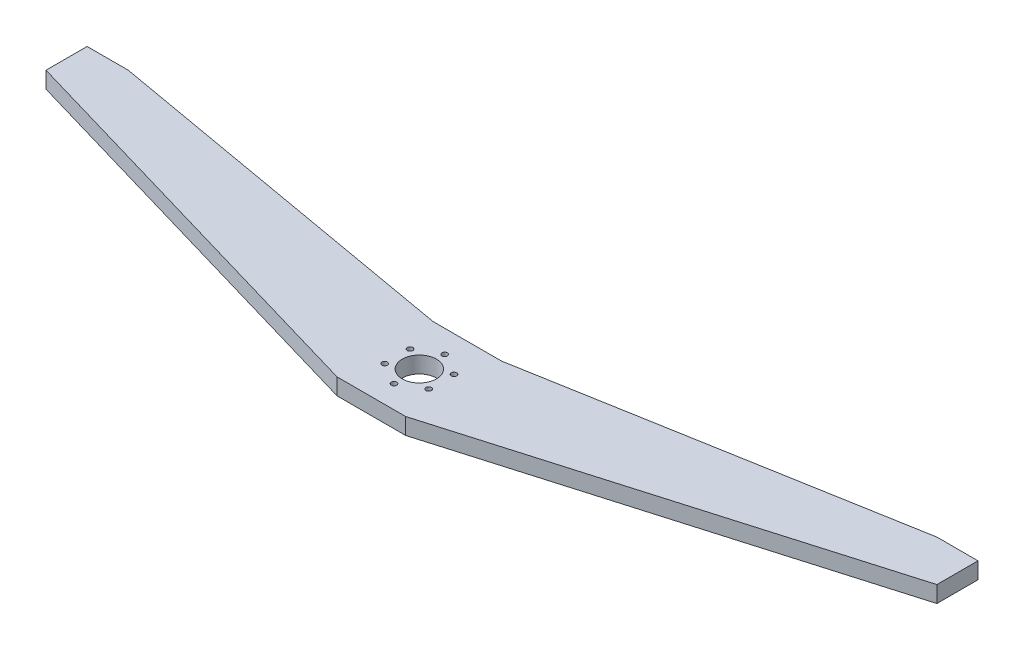
ISO-10303-21;
HEADER;
FILE_DESCRIPTION(('STEP AP214'),'2;1');
FILE_NAME('part.step','',(''),(''),'','','');
FILE_SCHEMA(('AUTOMOTIVE_DESIGN { 1 0 10303 214 1 1 1 1 }'));
ENDSEC;
DATA;
#1=APPLICATION_CONTEXT('core data for automotive mechanical design processes');
#2=APPLICATION_PROTOCOL_DEFINITION('international standard','automotive_design',2000,#1);
#3=PRODUCT_CONTEXT('',#1,'mechanical');
#4=PRODUCT('Part','Part','',(#3));
#5=PRODUCT_RELATED_PRODUCT_CATEGORY('part','',(#4));
#6=PRODUCT_DEFINITION_FORMATION('','',#4);
#7=PRODUCT_DEFINITION_CONTEXT('part definition',#1,'design');
#8=PRODUCT_DEFINITION('design','',#6,#7);
#9=PRODUCT_DEFINITION_SHAPE('','',#8);
#10=(LENGTH_UNIT() NAMED_UNIT(*) SI_UNIT(.MILLI.,.METRE.));
#11=(NAMED_UNIT(*) PLANE_ANGLE_UNIT() SI_UNIT($,.RADIAN.));
#12=(NAMED_UNIT(*) SI_UNIT($,.STERADIAN.) SOLID_ANGLE_UNIT());
#13=UNCERTAINTY_MEASURE_WITH_UNIT(LENGTH_MEASURE(1.E-05),#10,'distance_accuracy_value','');
#14=(GEOMETRIC_REPRESENTATION_CONTEXT(3) GLOBAL_UNCERTAINTY_ASSIGNED_CONTEXT((#13)) GLOBAL_UNIT_ASSIGNED_CONTEXT((#10,
#11,#12)) REPRESENTATION_CONTEXT('',''));
#15=CARTESIAN_POINT('',(0.,0.,0.));
#16=DIRECTION('',(0.,0.,1.));
#17=DIRECTION('',(1.,0.,0.));
#18=AXIS2_PLACEMENT_3D('',#15,#16,#17);
#19=CARTESIAN_POINT('',(-318.206861599198,12.,-87.6082847912839));
#20=DIRECTION('',(1.,0.,0.));
#21=DIRECTION('',(0.,0.,-1.));
#22=AXIS2_PLACEMENT_3D('',#19,#20,#21);
#23=PLANE('',#22);
#24=DIRECTION('',(0.,0.,1.));
#25=VECTOR('',#24,1.);
#26=CARTESIAN_POINT('',(-318.206861599198,0.,-87.6082847912839));
#27=LINE('',#26,#25);
#28=CARTESIAN_POINT('',(-318.206861599198,0.,-117.608284791284));
#29=VERTEX_POINT('',#28);
#30=CARTESIAN_POINT('',(-318.206861599198,0.,-87.6082847912839));
#31=VERTEX_POINT('',#30);
#32=EDGE_CURVE('E146',#29,#31,#27,.T.);
#33=ORIENTED_EDGE('',*,*,#32,.T.);
#34=DIRECTION('',(0.,-1.,0.));
#35=VECTOR('',#34,1.);
#36=CARTESIAN_POINT('',(-318.206861599198,12.,-87.6082847912839));
#37=LINE('',#36,#35);
#38=CARTESIAN_POINT('',(-318.206861599198,12.,-87.6082847912839));
#39=VERTEX_POINT('',#38);
#40=EDGE_CURVE('E11',#39,#31,#37,.T.);
#41=ORIENTED_EDGE('',*,*,#40,.F.);
#42=DIRECTION('',(0.,0.,1.));
#43=VECTOR('',#42,1.);
#44=CARTESIAN_POINT('',(-318.206861599198,12.,-87.6082847912839));
#45=LINE('',#44,#43);
#46=CARTESIAN_POINT('',(-318.206861599198,12.,-117.608284791284));
#47=VERTEX_POINT('',#46);
#48=EDGE_CURVE('E164',#47,#39,#45,.T.);
#49=ORIENTED_EDGE('',*,*,#48,.F.);
#50=DIRECTION('',(0.,-1.,0.));
#51=VECTOR('',#50,1.);
#52=CARTESIAN_POINT('',(-318.206861599198,12.,-117.608284791284));
#53=LINE('',#52,#51);
#54=EDGE_CURVE('E142',#47,#29,#53,.T.);
#55=ORIENTED_EDGE('',*,*,#54,.T.);
#56=EDGE_LOOP('',(#33,#41,#49,#55));
#57=FACE_BOUND('',#56,.T.);
#58=ADVANCED_FACE('F36',(#57),#23,.F.);
#59=CARTESIAN_POINT('',(-318.206861599198,12.,-87.6082847912839));
#60=DIRECTION('',(0.280319298356245,0.,-0.959906813690299));
#61=DIRECTION('',(-0.959906813690299,0.,-0.280319298356245));
#62=AXIS2_PLACEMENT_3D('',#59,#60,#61);
#63=PLANE('',#62);
#64=DIRECTION('',(0.959906813690299,0.,0.280319298356245));
#65=VECTOR('',#64,1.);
#66=CARTESIAN_POINT('',(-318.206861599198,0.,-87.6082847912839));
#67=LINE('',#66,#65);
#68=CARTESIAN_POINT('',(-18.2068615991978,0.,0.));
#69=VERTEX_POINT('',#68);
#70=EDGE_CURVE('E149',#31,#69,#67,.T.);
#71=ORIENTED_EDGE('',*,*,#70,.T.);
#72=DIRECTION('',(0.,-1.,0.));
#73=VECTOR('',#72,1.);
#74=CARTESIAN_POINT('',(-18.2068615991978,12.,0.));
#75=LINE('',#74,#73);
#76=CARTESIAN_POINT('',(-18.2068615991978,12.,0.));
#77=VERTEX_POINT('',#76);
#78=EDGE_CURVE('E45',#77,#69,#75,.T.);
#79=ORIENTED_EDGE('',*,*,#78,.F.);
#80=DIRECTION('',(0.959906813690299,0.,0.280319298356245));
#81=VECTOR('',#80,1.);
#82=CARTESIAN_POINT('',(-318.206861599198,12.,-87.6082847912839));
#83=LINE('',#82,#81);
#84=EDGE_CURVE('E103',#39,#77,#83,.T.);
#85=ORIENTED_EDGE('',*,*,#84,.F.);
#86=ORIENTED_EDGE('',*,*,#40,.T.);
#87=EDGE_LOOP('',(#71,#79,#85,#86));
#88=FACE_BOUND('',#87,.T.);
#89=ADVANCED_FACE('F239',(#88),#63,.F.);
#90=CARTESIAN_POINT('',(-18.2068615991978,12.,0.));
#91=DIRECTION('',(0.,0.,-1.));
#92=DIRECTION('',(-1.,0.,0.));
#93=AXIS2_PLACEMENT_3D('',#90,#91,#92);
#94=PLANE('',#93);
#95=DIRECTION('',(1.,0.,0.));
#96=VECTOR('',#95,1.);
#97=CARTESIAN_POINT('',(-18.2068615991978,0.,0.));
#98=LINE('',#97,#96);
#99=CARTESIAN_POINT('',(31.7931384008022,0.,0.));
#100=VERTEX_POINT('',#99);
#101=EDGE_CURVE('E151',#69,#100,#98,.T.);
#102=ORIENTED_EDGE('',*,*,#101,.T.);
#103=DIRECTION('',(0.,-1.,0.));
#104=VECTOR('',#103,1.);
#105=CARTESIAN_POINT('',(31.7931384008022,12.,0.));
#106=LINE('',#105,#104);
#107=CARTESIAN_POINT('',(31.7931384008022,12.,0.));
#108=VERTEX_POINT('',#107);
#109=EDGE_CURVE('E177',#108,#100,#106,.T.);
#110=ORIENTED_EDGE('',*,*,#109,.F.);
#111=DIRECTION('',(1.,0.,0.));
#112=VECTOR('',#111,1.);
#113=CARTESIAN_POINT('',(-18.2068615991978,12.,0.));
#114=LINE('',#113,#112);
#115=EDGE_CURVE('E381',#77,#108,#114,.T.);
#116=ORIENTED_EDGE('',*,*,#115,.F.);
#117=ORIENTED_EDGE('',*,*,#78,.T.);
#118=EDGE_LOOP('',(#102,#110,#116,#117));
#119=FACE_BOUND('',#118,.T.);
#120=ADVANCED_FACE('F243',(#119),#94,.F.);
#121=CARTESIAN_POINT('',(31.7931384008022,12.,0.));
#122=DIRECTION('',(-0.280319298356251,0.,-0.959906813690297));
#123=DIRECTION('',(-0.959906813690297,0.,0.280319298356251));
#124=AXIS2_PLACEMENT_3D('',#121,#122,#123);
#125=PLANE('',#124);
#126=DIRECTION('',(0.959906813690297,0.,-0.280319298356251));
#127=VECTOR('',#126,1.);
#128=CARTESIAN_POINT('',(31.7931384008022,0.,0.));
#129=LINE('',#128,#127);
#130=CARTESIAN_POINT('',(331.793138400802,0.,-87.6082847912857));
#131=VERTEX_POINT('',#130);
#132=EDGE_CURVE('E153',#100,#131,#129,.T.);
#133=ORIENTED_EDGE('',*,*,#132,.T.);
#134=DIRECTION('',(0.,-1.,0.));
#135=VECTOR('',#134,1.);
#136=CARTESIAN_POINT('',(331.793138400802,12.,-87.6082847912857));
#137=LINE('',#136,#135);
#138=CARTESIAN_POINT('',(331.793138400802,12.,-87.6082847912857));
#139=VERTEX_POINT('',#138);
#140=EDGE_CURVE('E174',#139,#131,#137,.T.);
#141=ORIENTED_EDGE('',*,*,#140,.F.);
#142=DIRECTION('',(0.959906813690297,0.,-0.280319298356251));
#143=VECTOR('',#142,1.);
#144=CARTESIAN_POINT('',(31.7931384008022,12.,0.));
#145=LINE('',#144,#143);
#146=EDGE_CURVE('E383',#108,#139,#145,.T.);
#147=ORIENTED_EDGE('',*,*,#146,.F.);
#148=ORIENTED_EDGE('',*,*,#109,.T.);
#149=EDGE_LOOP('',(#133,#141,#147,#148));
#150=FACE_BOUND('',#149,.T.);
#151=ADVANCED_FACE('F247',(#150),#125,.F.);
#152=CARTESIAN_POINT('',(331.793138400802,12.,-87.6082847912857));
#153=DIRECTION('',(-1.,0.,0.));
#154=DIRECTION('',(0.,0.,1.));
#155=AXIS2_PLACEMENT_3D('',#152,#153,#154);
#156=PLANE('',#155);
#157=DIRECTION('',(0.,0.,-1.));
#158=VECTOR('',#157,1.);
#159=CARTESIAN_POINT('',(331.793138400802,0.,-87.6082847912857));
#160=LINE('',#159,#158);
#161=CARTESIAN_POINT('',(331.793138400802,0.,-117.608284791286));
#162=VERTEX_POINT('',#161);
#163=EDGE_CURVE('E155',#131,#162,#160,.T.);
#164=ORIENTED_EDGE('',*,*,#163,.T.);
#165=DIRECTION('',(0.,-1.,0.));
#166=VECTOR('',#165,1.);
#167=CARTESIAN_POINT('',(331.793138400802,12.,-117.608284791286));
#168=LINE('',#167,#166);
#169=CARTESIAN_POINT('',(331.793138400802,12.,-117.608284791286));
#170=VERTEX_POINT('',#169);
#171=EDGE_CURVE('E171',#170,#162,#168,.T.);
#172=ORIENTED_EDGE('',*,*,#171,.F.);
#173=DIRECTION('',(0.,0.,-1.));
#174=VECTOR('',#173,1.);
#175=CARTESIAN_POINT('',(331.793138400802,12.,-87.6082847912857));
#176=LINE('',#175,#174);
#177=EDGE_CURVE('E385',#139,#170,#176,.T.);
#178=ORIENTED_EDGE('',*,*,#177,.F.);
#179=ORIENTED_EDGE('',*,*,#140,.T.);
#180=EDGE_LOOP('',(#164,#172,#178,#179));
#181=FACE_BOUND('',#180,.T.);
#182=ADVANCED_FACE('F253',(#181),#156,.F.);
#183=CARTESIAN_POINT('',(331.793138400802,12.,-117.608284791286));
#184=DIRECTION('',(0.,0.,1.));
#185=DIRECTION('',(1.,0.,0.));
#186=AXIS2_PLACEMENT_3D('',#183,#184,#185);
#187=PLANE('',#186);
#188=DIRECTION('',(-1.,0.,0.));
#189=VECTOR('',#188,1.);
#190=CARTESIAN_POINT('',(331.793138400802,0.,-117.608284791286));
#191=LINE('',#190,#189);
#192=CARTESIAN_POINT('',(301.793138400802,0.,-117.608284791286));
#193=VERTEX_POINT('',#192);
#194=EDGE_CURVE('E157',#162,#193,#191,.T.);
#195=ORIENTED_EDGE('',*,*,#194,.T.);
#196=DIRECTION('',(0.,-1.,0.));
#197=VECTOR('',#196,1.);
#198=CARTESIAN_POINT('',(301.793138400802,12.,-117.608284791286));
#199=LINE('',#198,#197);
#200=CARTESIAN_POINT('',(301.793138400802,12.,-117.608284791286));
#201=VERTEX_POINT('',#200);
#202=EDGE_CURVE('E168',#201,#193,#199,.T.);
#203=ORIENTED_EDGE('',*,*,#202,.F.);
#204=DIRECTION('',(-1.,0.,0.));
#205=VECTOR('',#204,1.);
#206=CARTESIAN_POINT('',(331.793138400802,12.,-117.608284791286));
#207=LINE('',#206,#205);
#208=EDGE_CURVE('E387',#170,#201,#207,.T.);
#209=ORIENTED_EDGE('',*,*,#208,.F.);
#210=ORIENTED_EDGE('',*,*,#171,.T.);
#211=EDGE_LOOP('',(#195,#203,#209,#210));
#212=FACE_BOUND('',#211,.T.);
#213=ADVANCED_FACE('F257',(#212),#187,.F.);
#214=CARTESIAN_POINT('',(301.793138400802,12.,-117.608284791286));
#215=DIRECTION('',(0.173648177666931,0.,0.984807753012208));
#216=DIRECTION('',(0.984807753012208,0.,-0.173648177666931));
#217=AXIS2_PLACEMENT_3D('',#214,#215,#216);
#218=PLANE('',#217);
#219=DIRECTION('',(-0.984807753012208,0.,0.173648177666931));
#220=VECTOR('',#219,1.);
#221=CARTESIAN_POINT('',(301.793138400802,0.,-117.608284791286));
#222=LINE('',#221,#220);
#223=CARTESIAN_POINT('',(31.7931384008021,0.,-70.));
#224=VERTEX_POINT('',#223);
#225=EDGE_CURVE('E159',#193,#224,#222,.T.);
#226=ORIENTED_EDGE('',*,*,#225,.T.);
#227=DIRECTION('',(0.,-1.,0.));
#228=VECTOR('',#227,1.);
#229=CARTESIAN_POINT('',(31.7931384008021,12.,-70.));
#230=LINE('',#229,#228);
#231=CARTESIAN_POINT('',(31.7931384008021,12.,-70.));
#232=VERTEX_POINT('',#231);
#233=EDGE_CURVE('E137',#232,#224,#230,.T.);
#234=ORIENTED_EDGE('',*,*,#233,.F.);
#235=DIRECTION('',(-0.984807753012208,0.,0.173648177666931));
#236=VECTOR('',#235,1.);
#237=CARTESIAN_POINT('',(301.793138400802,12.,-117.608284791286));
#238=LINE('',#237,#236);
#239=EDGE_CURVE('E128',#201,#232,#238,.T.);
#240=ORIENTED_EDGE('',*,*,#239,.F.);
#241=ORIENTED_EDGE('',*,*,#202,.T.);
#242=EDGE_LOOP('',(#226,#234,#240,#241));
#243=FACE_BOUND('',#242,.T.);
#244=ADVANCED_FACE('F261',(#243),#218,.F.);
#245=CARTESIAN_POINT('',(31.7931384008021,12.,-70.));
#246=DIRECTION('',(0.,0.,1.));
#247=DIRECTION('',(1.,0.,0.));
#248=AXIS2_PLACEMENT_3D('',#245,#246,#247);
#249=PLANE('',#248);
#250=DIRECTION('',(-1.,0.,0.));
#251=VECTOR('',#250,1.);
#252=CARTESIAN_POINT('',(31.7931384008021,0.,-70.));
#253=LINE('',#252,#251);
#254=CARTESIAN_POINT('',(-18.2068615991979,0.,-70.));
#255=VERTEX_POINT('',#254);
#256=EDGE_CURVE('E136',#224,#255,#253,.T.);
#257=ORIENTED_EDGE('',*,*,#256,.T.);
#258=DIRECTION('',(0.,-1.,0.));
#259=VECTOR('',#258,1.);
#260=CARTESIAN_POINT('',(-18.2068615991979,12.,-70.));
#261=LINE('',#260,#259);
#262=CARTESIAN_POINT('',(-18.2068615991979,12.,-70.));
#263=VERTEX_POINT('',#262);
#264=EDGE_CURVE('E133',#263,#255,#261,.T.);
#265=ORIENTED_EDGE('',*,*,#264,.F.);
#266=DIRECTION('',(-1.,0.,0.));
#267=VECTOR('',#266,1.);
#268=CARTESIAN_POINT('',(31.7931384008021,12.,-70.));
#269=LINE('',#268,#267);
#270=EDGE_CURVE('E122',#232,#263,#269,.T.);
#271=ORIENTED_EDGE('',*,*,#270,.F.);
#272=ORIENTED_EDGE('',*,*,#233,.T.);
#273=EDGE_LOOP('',(#257,#265,#271,#272));
#274=FACE_BOUND('',#273,.T.);
#275=ADVANCED_FACE('F134',(#274),#249,.F.);
#276=CARTESIAN_POINT('',(-288.206861599198,12.,-117.608284791284));
#277=DIRECTION('',(-0.173648177666924,0.,0.984807753012209));
#278=DIRECTION('',(0.984807753012209,0.,0.173648177666924));
#279=AXIS2_PLACEMENT_3D('',#276,#277,#278);
#280=PLANE('',#279);
#281=DIRECTION('',(-0.984807753012209,0.,-0.173648177666924));
#282=VECTOR('',#281,1.);
#283=CARTESIAN_POINT('',(-288.206861599198,0.,-117.608284791284));
#284=LINE('',#283,#282);
#285=CARTESIAN_POINT('',(-288.206861599198,0.,-117.608284791284));
#286=VERTEX_POINT('',#285);
#287=EDGE_CURVE('E89',#255,#286,#284,.T.);
#288=ORIENTED_EDGE('',*,*,#287,.T.);
#289=DIRECTION('',(0.,-1.,0.));
#290=VECTOR('',#289,1.);
#291=CARTESIAN_POINT('',(-288.206861599198,12.,-117.608284791284));
#292=LINE('',#291,#290);
#293=CARTESIAN_POINT('',(-288.206861599198,12.,-117.608284791284));
#294=VERTEX_POINT('',#293);
#295=EDGE_CURVE('E138',#294,#286,#292,.T.);
#296=ORIENTED_EDGE('',*,*,#295,.F.);
#297=DIRECTION('',(-0.984807753012209,0.,-0.173648177666924));
#298=VECTOR('',#297,1.);
#299=CARTESIAN_POINT('',(-288.206861599198,12.,-117.608284791284));
#300=LINE('',#299,#298);
#301=EDGE_CURVE('E126',#263,#294,#300,.T.);
#302=ORIENTED_EDGE('',*,*,#301,.F.);
#303=ORIENTED_EDGE('',*,*,#264,.T.);
#304=EDGE_LOOP('',(#288,#296,#302,#303));
#305=FACE_BOUND('',#304,.T.);
#306=ADVANCED_FACE('F140',(#305),#280,.F.);
#307=CARTESIAN_POINT('',(-318.206861599198,12.,-117.608284791284));
#308=DIRECTION('',(0.,0.,1.));
#309=DIRECTION('',(1.,0.,0.));
#310=AXIS2_PLACEMENT_3D('',#307,#308,#309);
#311=PLANE('',#310);
#312=DIRECTION('',(-1.,0.,0.));
#313=VECTOR('',#312,1.);
#314=CARTESIAN_POINT('',(-318.206861599198,0.,-117.608284791284));
#315=LINE('',#314,#313);
#316=EDGE_CURVE('E95',#286,#29,#315,.T.);
#317=ORIENTED_EDGE('',*,*,#316,.T.);
#318=ORIENTED_EDGE('',*,*,#54,.F.);
#319=DIRECTION('',(-1.,0.,0.));
#320=VECTOR('',#319,1.);
#321=CARTESIAN_POINT('',(-318.206861599198,12.,-117.608284791284));
#322=LINE('',#321,#320);
#323=EDGE_CURVE('E54',#294,#47,#322,.T.);
#324=ORIENTED_EDGE('',*,*,#323,.F.);
#325=ORIENTED_EDGE('',*,*,#295,.T.);
#326=EDGE_LOOP('',(#317,#318,#324,#325));
#327=FACE_BOUND('',#326,.T.);
#328=ADVANCED_FACE('F228',(#327),#311,.F.);
#329=CARTESIAN_POINT('',(0.,12.,0.));
#330=DIRECTION('',(0.,-1.,0.));
#331=DIRECTION('',(0.,0.,-1.));
#332=AXIS2_PLACEMENT_3D('',#329,#330,#331);
#333=PLANE('',#332);
#334=CARTESIAN_POINT('',(-9.22833156920977,12.,-44.2499999999998));
#335=DIRECTION('',(0.,1.,0.));
#336=DIRECTION('',(0.,0.,1.));
#337=AXIS2_PLACEMENT_3D('',#334,#335,#336);
#338=CIRCLE('',#337,2.);
#339=CARTESIAN_POINT('',(-9.22833156920977,12.,-42.2499999999998));
#340=VERTEX_POINT('',#339);
#341=EDGE_CURVE('E367',#340,#340,#338,.T.);
#342=ORIENTED_EDGE('',*,*,#341,.F.);
#343=EDGE_LOOP('',(#342));
#344=FACE_BOUND('',#343,.T.);
#345=CARTESIAN_POINT('',(-9.2283315692095,12.,-25.7499999999998));
#346=DIRECTION('',(0.,1.,0.));
#347=DIRECTION('',(0.,0.,1.));
#348=AXIS2_PLACEMENT_3D('',#345,#346,#347);
#349=CIRCLE('',#348,1.99999999999998);
#350=CARTESIAN_POINT('',(-9.2283315692095,12.,-23.7499999999998));
#351=VERTEX_POINT('',#350);
#352=EDGE_CURVE('E364',#351,#351,#349,.T.);
#353=ORIENTED_EDGE('',*,*,#352,.F.);
#354=EDGE_LOOP('',(#353));
#355=FACE_BOUND('',#354,.T.);
#356=CARTESIAN_POINT('',(6.79313840080276,12.,-16.5));
#357=DIRECTION('',(0.,1.,0.));
#358=DIRECTION('',(0.,0.,1.));
#359=AXIS2_PLACEMENT_3D('',#356,#357,#358);
#360=CIRCLE('',#359,1.99999999999994);
#361=CARTESIAN_POINT('',(6.79313840080276,12.,-14.5000000000001));
#362=VERTEX_POINT('',#361);
#363=EDGE_CURVE('E366',#362,#362,#360,.T.);
#364=ORIENTED_EDGE('',*,*,#363,.F.);
#365=EDGE_LOOP('',(#364));
#366=FACE_BOUND('',#365,.T.);
#367=CARTESIAN_POINT('',(22.8146083708147,12.,-25.7500000000002));
#368=DIRECTION('',(0.,1.,0.));
#369=DIRECTION('',(0.,0.,1.));
#370=AXIS2_PLACEMENT_3D('',#367,#368,#369);
#371=CIRCLE('',#370,1.99999999999989);
#372=CARTESIAN_POINT('',(22.8146083708147,12.,-23.7500000000003));
#373=VERTEX_POINT('',#372);
#374=EDGE_CURVE('E370',#373,#373,#371,.T.);
#375=ORIENTED_EDGE('',*,*,#374,.F.);
#376=EDGE_LOOP('',(#375));
#377=FACE_BOUND('',#376,.T.);
#378=CARTESIAN_POINT('',(22.8146083708145,12.,-44.2500000000002));
#379=DIRECTION('',(0.,1.,0.));
#380=DIRECTION('',(0.,0.,1.));
#381=AXIS2_PLACEMENT_3D('',#378,#379,#380);
#382=CIRCLE('',#381,2.00000000000001);
#383=CARTESIAN_POINT('',(22.8146083708145,12.,-42.2500000000002));
#384=VERTEX_POINT('',#383);
#385=EDGE_CURVE('E403',#384,#384,#382,.T.);
#386=ORIENTED_EDGE('',*,*,#385,.F.);
#387=EDGE_LOOP('',(#386));
#388=FACE_BOUND('',#387,.T.);
#389=CARTESIAN_POINT('',(6.79313840080222,12.,-53.5));
#390=DIRECTION('',(0.,1.,0.));
#391=DIRECTION('',(0.,0.,1.));
#392=AXIS2_PLACEMENT_3D('',#389,#390,#391);
#393=CIRCLE('',#392,2.);
#394=CARTESIAN_POINT('',(6.79313840080222,12.,-51.5));
#395=VERTEX_POINT('',#394);
#396=EDGE_CURVE('E378',#395,#395,#393,.T.);
#397=ORIENTED_EDGE('',*,*,#396,.F.);
#398=EDGE_LOOP('',(#397));
#399=FACE_BOUND('',#398,.T.);
#400=CARTESIAN_POINT('',(6.79313840080203,12.,-35.));
#401=DIRECTION('',(0.,1.,0.));
#402=DIRECTION('',(0.,0.,1.));
#403=AXIS2_PLACEMENT_3D('',#400,#401,#402);
#404=CIRCLE('',#403,12.5);
#405=CARTESIAN_POINT('',(6.79313840080203,12.,-22.5));
#406=VERTEX_POINT('',#405);
#407=EDGE_CURVE('E186',#406,#406,#404,.T.);
#408=ORIENTED_EDGE('',*,*,#407,.F.);
#409=EDGE_LOOP('',(#408));
#410=FACE_BOUND('',#409,.T.);
#411=ORIENTED_EDGE('',*,*,#48,.T.);
#412=ORIENTED_EDGE('',*,*,#84,.T.);
#413=ORIENTED_EDGE('',*,*,#115,.T.);
#414=ORIENTED_EDGE('',*,*,#146,.T.);
#415=ORIENTED_EDGE('',*,*,#177,.T.);
#416=ORIENTED_EDGE('',*,*,#208,.T.);
#417=ORIENTED_EDGE('',*,*,#239,.T.);
#418=ORIENTED_EDGE('',*,*,#270,.T.);
#419=ORIENTED_EDGE('',*,*,#301,.T.);
#420=ORIENTED_EDGE('',*,*,#323,.T.);
#421=EDGE_LOOP('',(#411,#412,#413,#414,#415,#416,#417,#418,#419,#420));
#422=FACE_BOUND('',#421,.T.);
#423=ADVANCED_FACE('F124',(#344,#355,#366,#377,#388,#399,#410,#422),#333,.F.);
#424=CARTESIAN_POINT('',(0.,0.,0.));
#425=DIRECTION('',(0.,-1.,0.));
#426=DIRECTION('',(0.,0.,-1.));
#427=AXIS2_PLACEMENT_3D('',#424,#425,#426);
#428=PLANE('',#427);
#429=CARTESIAN_POINT('',(-9.22833156920977,0.,-44.2499999999998));
#430=DIRECTION('',(0.,-1.,0.));
#431=DIRECTION('',(0.,0.,-1.));
#432=AXIS2_PLACEMENT_3D('',#429,#430,#431);
#433=CIRCLE('',#432,2.);
#434=CARTESIAN_POINT('',(-9.22833156920977,0.,-46.2499999999998));
#435=VERTEX_POINT('',#434);
#436=EDGE_CURVE('E39',#435,#435,#433,.T.);
#437=ORIENTED_EDGE('',*,*,#436,.F.);
#438=EDGE_LOOP('',(#437));
#439=FACE_BOUND('',#438,.T.);
#440=CARTESIAN_POINT('',(-9.2283315692095,0.,-25.7499999999998));
#441=DIRECTION('',(0.,-1.,0.));
#442=DIRECTION('',(0.,0.,-1.));
#443=AXIS2_PLACEMENT_3D('',#440,#441,#442);
#444=CIRCLE('',#443,1.99999999999998);
#445=CARTESIAN_POINT('',(-9.2283315692095,0.,-27.7499999999997));
#446=VERTEX_POINT('',#445);
#447=EDGE_CURVE('E197',#446,#446,#444,.T.);
#448=ORIENTED_EDGE('',*,*,#447,.F.);
#449=EDGE_LOOP('',(#448));
#450=FACE_BOUND('',#449,.T.);
#451=CARTESIAN_POINT('',(6.79313840080276,0.,-16.5));
#452=DIRECTION('',(0.,-1.,0.));
#453=DIRECTION('',(0.,0.,-1.));
#454=AXIS2_PLACEMENT_3D('',#451,#452,#453);
#455=CIRCLE('',#454,1.99999999999994);
#456=CARTESIAN_POINT('',(6.79313840080276,0.,-18.4999999999999));
#457=VERTEX_POINT('',#456);
#458=EDGE_CURVE('E195',#457,#457,#455,.T.);
#459=ORIENTED_EDGE('',*,*,#458,.F.);
#460=EDGE_LOOP('',(#459));
#461=FACE_BOUND('',#460,.T.);
#462=CARTESIAN_POINT('',(22.8146083708147,0.,-25.7500000000002));
#463=DIRECTION('',(0.,-1.,0.));
#464=DIRECTION('',(0.,0.,-1.));
#465=AXIS2_PLACEMENT_3D('',#462,#463,#464);
#466=CIRCLE('',#465,1.99999999999989);
#467=CARTESIAN_POINT('',(22.8146083708147,0.,-27.7500000000001));
#468=VERTEX_POINT('',#467);
#469=EDGE_CURVE('E192',#468,#468,#466,.T.);
#470=ORIENTED_EDGE('',*,*,#469,.F.);
#471=EDGE_LOOP('',(#470));
#472=FACE_BOUND('',#471,.T.);
#473=CARTESIAN_POINT('',(22.8146083708145,0.,-44.2500000000002));
#474=DIRECTION('',(0.,-1.,0.));
#475=DIRECTION('',(0.,0.,-1.));
#476=AXIS2_PLACEMENT_3D('',#473,#474,#475);
#477=CIRCLE('',#476,2.00000000000001);
#478=CARTESIAN_POINT('',(22.8146083708145,0.,-46.2500000000002));
#479=VERTEX_POINT('',#478);
#480=EDGE_CURVE('E189',#479,#479,#477,.T.);
#481=ORIENTED_EDGE('',*,*,#480,.F.);
#482=EDGE_LOOP('',(#481));
#483=FACE_BOUND('',#482,.T.);
#484=CARTESIAN_POINT('',(6.79313840080222,0.,-53.5));
#485=DIRECTION('',(0.,-1.,0.));
#486=DIRECTION('',(0.,0.,-1.));
#487=AXIS2_PLACEMENT_3D('',#484,#485,#486);
#488=CIRCLE('',#487,2.);
#489=CARTESIAN_POINT('',(6.79313840080222,0.,-55.5));
#490=VERTEX_POINT('',#489);
#491=EDGE_CURVE('E185',#490,#490,#488,.T.);
#492=ORIENTED_EDGE('',*,*,#491,.F.);
#493=EDGE_LOOP('',(#492));
#494=FACE_BOUND('',#493,.T.);
#495=CARTESIAN_POINT('',(6.79313840080203,0.,-35.));
#496=DIRECTION('',(0.,-1.,0.));
#497=DIRECTION('',(0.,0.,-1.));
#498=AXIS2_PLACEMENT_3D('',#495,#496,#497);
#499=CIRCLE('',#498,12.5);
#500=CARTESIAN_POINT('',(6.79313840080203,0.,-47.5));
#501=VERTEX_POINT('',#500);
#502=EDGE_CURVE('E182',#501,#501,#499,.T.);
#503=ORIENTED_EDGE('',*,*,#502,.F.);
#504=EDGE_LOOP('',(#503));
#505=FACE_BOUND('',#504,.T.);
#506=ORIENTED_EDGE('',*,*,#32,.F.);
#507=ORIENTED_EDGE('',*,*,#316,.F.);
#508=ORIENTED_EDGE('',*,*,#287,.F.);
#509=ORIENTED_EDGE('',*,*,#256,.F.);
#510=ORIENTED_EDGE('',*,*,#225,.F.);
#511=ORIENTED_EDGE('',*,*,#194,.F.);
#512=ORIENTED_EDGE('',*,*,#163,.F.);
#513=ORIENTED_EDGE('',*,*,#132,.F.);
#514=ORIENTED_EDGE('',*,*,#101,.F.);
#515=ORIENTED_EDGE('',*,*,#70,.F.);
#516=EDGE_LOOP('',(#506,#507,#508,#509,#510,#511,#512,#513,#514,#515));
#517=FACE_BOUND('',#516,.T.);
#518=ADVANCED_FACE('F207',(#439,#450,#461,#472,#483,#494,#505,#517),#428,.T.);
#519=CARTESIAN_POINT('',(6.79313840080203,-8.,-35.));
#520=DIRECTION('',(0.,1.,0.));
#521=DIRECTION('',(0.,0.,1.));
#522=AXIS2_PLACEMENT_3D('',#519,#520,#521);
#523=CYLINDRICAL_SURFACE('',#522,12.5);
#524=ORIENTED_EDGE('',*,*,#502,.T.);
#525=EDGE_LOOP('',(#524));
#526=FACE_BOUND('',#525,.T.);
#527=ORIENTED_EDGE('',*,*,#407,.T.);
#528=EDGE_LOOP('',(#527));
#529=FACE_BOUND('',#528,.T.);
#530=ADVANCED_FACE('F210',(#526,#529),#523,.F.);
#531=CARTESIAN_POINT('',(6.79313840080222,-8.,-53.5));
#532=DIRECTION('',(0.,1.,0.));
#533=DIRECTION('',(0.,0.,1.));
#534=AXIS2_PLACEMENT_3D('',#531,#532,#533);
#535=CYLINDRICAL_SURFACE('',#534,2.);
#536=ORIENTED_EDGE('',*,*,#491,.T.);
#537=EDGE_LOOP('',(#536));
#538=FACE_BOUND('',#537,.T.);
#539=ORIENTED_EDGE('',*,*,#396,.T.);
#540=EDGE_LOOP('',(#539));
#541=FACE_BOUND('',#540,.T.);
#542=ADVANCED_FACE('F300',(#538,#541),#535,.F.);
#543=CARTESIAN_POINT('',(22.8146083708145,-8.,-44.2500000000002));
#544=DIRECTION('',(0.,1.,0.));
#545=DIRECTION('',(0.,0.,1.));
#546=AXIS2_PLACEMENT_3D('',#543,#544,#545);
#547=CYLINDRICAL_SURFACE('',#546,2.00000000000001);
#548=ORIENTED_EDGE('',*,*,#480,.T.);
#549=EDGE_LOOP('',(#548));
#550=FACE_BOUND('',#549,.T.);
#551=ORIENTED_EDGE('',*,*,#385,.T.);
#552=EDGE_LOOP('',(#551));
#553=FACE_BOUND('',#552,.T.);
#554=ADVANCED_FACE('F310',(#550,#553),#547,.F.);
#555=CARTESIAN_POINT('',(22.8146083708147,-8.,-25.7500000000002));
#556=DIRECTION('',(0.,1.,0.));
#557=DIRECTION('',(0.,0.,1.));
#558=AXIS2_PLACEMENT_3D('',#555,#556,#557);
#559=CYLINDRICAL_SURFACE('',#558,1.99999999999989);
#560=ORIENTED_EDGE('',*,*,#469,.T.);
#561=EDGE_LOOP('',(#560));
#562=FACE_BOUND('',#561,.T.);
#563=ORIENTED_EDGE('',*,*,#374,.T.);
#564=EDGE_LOOP('',(#563));
#565=FACE_BOUND('',#564,.T.);
#566=ADVANCED_FACE('F320',(#562,#565),#559,.F.);
#567=CARTESIAN_POINT('',(6.79313840080276,-8.,-16.5));
#568=DIRECTION('',(0.,1.,0.));
#569=DIRECTION('',(0.,0.,1.));
#570=AXIS2_PLACEMENT_3D('',#567,#568,#569);
#571=CYLINDRICAL_SURFACE('',#570,1.99999999999994);
#572=ORIENTED_EDGE('',*,*,#458,.T.);
#573=EDGE_LOOP('',(#572));
#574=FACE_BOUND('',#573,.T.);
#575=ORIENTED_EDGE('',*,*,#363,.T.);
#576=EDGE_LOOP('',(#575));
#577=FACE_BOUND('',#576,.T.);
#578=ADVANCED_FACE('F330',(#574,#577),#571,.F.);
#579=CARTESIAN_POINT('',(-9.2283315692095,-8.,-25.7499999999998));
#580=DIRECTION('',(0.,1.,0.));
#581=DIRECTION('',(0.,0.,1.));
#582=AXIS2_PLACEMENT_3D('',#579,#580,#581);
#583=CYLINDRICAL_SURFACE('',#582,1.99999999999998);
#584=ORIENTED_EDGE('',*,*,#447,.T.);
#585=EDGE_LOOP('',(#584));
#586=FACE_BOUND('',#585,.T.);
#587=ORIENTED_EDGE('',*,*,#352,.T.);
#588=EDGE_LOOP('',(#587));
#589=FACE_BOUND('',#588,.T.);
#590=ADVANCED_FACE('F340',(#586,#589),#583,.F.);
#591=CARTESIAN_POINT('',(-9.22833156920977,-8.,-44.2499999999998));
#592=DIRECTION('',(0.,1.,0.));
#593=DIRECTION('',(0.,0.,1.));
#594=AXIS2_PLACEMENT_3D('',#591,#592,#593);
#595=CYLINDRICAL_SURFACE('',#594,2.);
#596=ORIENTED_EDGE('',*,*,#436,.T.);
#597=EDGE_LOOP('',(#596));
#598=FACE_BOUND('',#597,.T.);
#599=ORIENTED_EDGE('',*,*,#341,.T.);
#600=EDGE_LOOP('',(#599));
#601=FACE_BOUND('',#600,.T.);
#602=ADVANCED_FACE('F204',(#598,#601),#595,.F.);
#603=CLOSED_SHELL('',(#58,#89,#120,#151,#182,#213,#244,#275,#306,#328,#423,#518,#530,#542,#554,
#566,#578,#590,#602));
#604=MANIFOLD_SOLID_BREP('B2',#603);
#605=ADVANCED_BREP_SHAPE_REPRESENTATION('',(#18,#604),#14);
#606=SHAPE_DEFINITION_REPRESENTATION(#9,#605);
ENDSEC;
END-ISO-10303-21;
